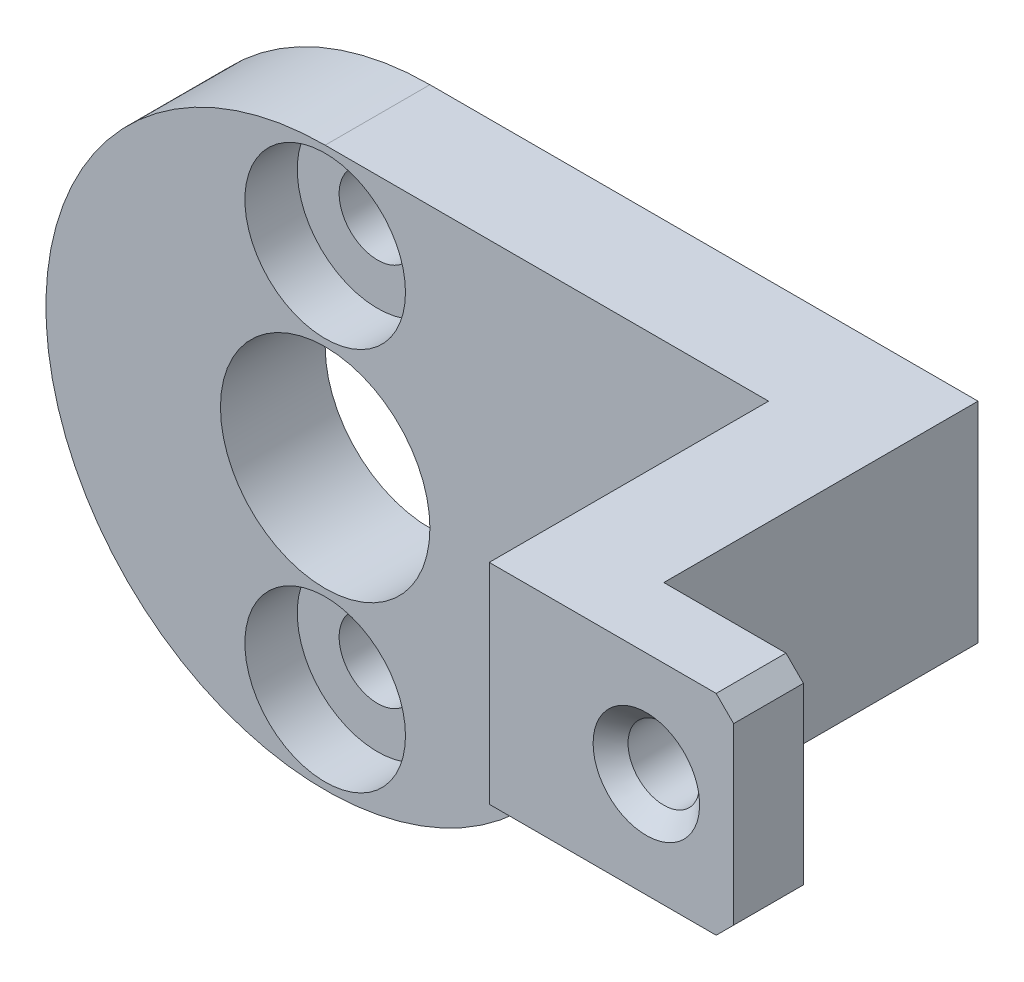
ISO-10303-21;
HEADER;
FILE_DESCRIPTION(('STEP AP214'),'2;1');
FILE_NAME('part.step','',(''),(''),'','','');
FILE_SCHEMA(('AUTOMOTIVE_DESIGN { 1 0 10303 214 1 1 1 1 }'));
ENDSEC;
DATA;
#1=APPLICATION_CONTEXT('core data for automotive mechanical design processes');
#2=APPLICATION_PROTOCOL_DEFINITION('international standard','automotive_design',2000,#1);
#3=PRODUCT_CONTEXT('',#1,'mechanical');
#4=PRODUCT('Part','Part','',(#3));
#5=PRODUCT_RELATED_PRODUCT_CATEGORY('part','',(#4));
#6=PRODUCT_DEFINITION_FORMATION('','',#4);
#7=PRODUCT_DEFINITION_CONTEXT('part definition',#1,'design');
#8=PRODUCT_DEFINITION('design','',#6,#7);
#9=PRODUCT_DEFINITION_SHAPE('','',#8);
#10=(LENGTH_UNIT() NAMED_UNIT(*) SI_UNIT(.MILLI.,.METRE.));
#11=(NAMED_UNIT(*) PLANE_ANGLE_UNIT() SI_UNIT($,.RADIAN.));
#12=(NAMED_UNIT(*) SI_UNIT($,.STERADIAN.) SOLID_ANGLE_UNIT());
#13=UNCERTAINTY_MEASURE_WITH_UNIT(LENGTH_MEASURE(1.E-05),#10,'distance_accuracy_value','');
#14=(GEOMETRIC_REPRESENTATION_CONTEXT(3) GLOBAL_UNCERTAINTY_ASSIGNED_CONTEXT((#13)) GLOBAL_UNIT_ASSIGNED_CONTEXT((#10,
#11,#12)) REPRESENTATION_CONTEXT('',''));
#15=CARTESIAN_POINT('',(0.,0.,0.));
#16=DIRECTION('',(0.,0.,1.));
#17=DIRECTION('',(1.,0.,0.));
#18=AXIS2_PLACEMENT_3D('',#15,#16,#17);
#19=CARTESIAN_POINT('',(-7.15,8.,1.));
#20=DIRECTION('',(0.,-1.,0.));
#21=DIRECTION('',(0.,0.,-1.));
#22=AXIS2_PLACEMENT_3D('',#19,#20,#21);
#23=PLANE('',#22);
#24=DIRECTION('',(0.,0.,-1.));
#25=VECTOR('',#24,1.);
#26=CARTESIAN_POINT('',(10.15,8.,7.));
#27=LINE('',#26,#25);
#28=CARTESIAN_POINT('',(10.15,8.,9.));
#29=VERTEX_POINT('',#28);
#30=CARTESIAN_POINT('',(10.15,8.,1.));
#31=VERTEX_POINT('',#30);
#32=EDGE_CURVE('E126',#29,#31,#27,.T.);
#33=ORIENTED_EDGE('',*,*,#32,.F.);
#34=DIRECTION('',(-1.,0.,0.));
#35=VECTOR('',#34,1.);
#36=CARTESIAN_POINT('',(7.15,8.,9.));
#37=LINE('',#36,#35);
#38=CARTESIAN_POINT('',(16.65,8.,9.));
#39=VERTEX_POINT('',#38);
#40=EDGE_CURVE('E129',#39,#29,#37,.T.);
#41=ORIENTED_EDGE('',*,*,#40,.F.);
#42=DIRECTION('',(0.,0.,-1.));
#43=VECTOR('',#42,1.);
#44=CARTESIAN_POINT('',(16.65,8.,7.));
#45=LINE('',#44,#43);
#46=CARTESIAN_POINT('',(16.65,8.,7.));
#47=VERTEX_POINT('',#46);
#48=EDGE_CURVE('E242',#39,#47,#45,.T.);
#49=ORIENTED_EDGE('',*,*,#48,.T.);
#50=DIRECTION('',(-1.,0.,0.));
#51=VECTOR('',#50,1.);
#52=CARTESIAN_POINT('',(17.15,8.,7.));
#53=LINE('',#52,#51);
#54=CARTESIAN_POINT('',(13.15,8.,7.));
#55=VERTEX_POINT('',#54);
#56=EDGE_CURVE('E152',#47,#55,#53,.T.);
#57=ORIENTED_EDGE('',*,*,#56,.T.);
#58=DIRECTION('',(0.,0.,1.));
#59=VECTOR('',#58,1.);
#60=CARTESIAN_POINT('',(13.15,8.,-0.999999999999999));
#61=LINE('',#60,#59);
#62=CARTESIAN_POINT('',(13.15,8.,-2.));
#63=VERTEX_POINT('',#62);
#64=EDGE_CURVE('E204',#63,#55,#61,.T.);
#65=ORIENTED_EDGE('',*,*,#64,.F.);
#66=DIRECTION('',(1.,0.,0.));
#67=VECTOR('',#66,1.);
#68=CARTESIAN_POINT('',(-10.55,8.,-2.));
#69=LINE('',#68,#67);
#70=CARTESIAN_POINT('',(-2.55,8.,-2.));
#71=VERTEX_POINT('',#70);
#72=EDGE_CURVE('E196',#71,#63,#69,.T.);
#73=ORIENTED_EDGE('',*,*,#72,.F.);
#74=DIRECTION('',(0.,0.,-1.));
#75=VECTOR('',#74,1.);
#76=CARTESIAN_POINT('',(-2.55,8.,8.));
#77=LINE('',#76,#75);
#78=CARTESIAN_POINT('',(-2.55,8.,1.));
#79=VERTEX_POINT('',#78);
#80=EDGE_CURVE('E343',#79,#71,#77,.T.);
#81=ORIENTED_EDGE('',*,*,#80,.F.);
#82=DIRECTION('',(-1.,0.,0.));
#83=VECTOR('',#82,1.);
#84=CARTESIAN_POINT('',(-7.15,8.,1.));
#85=LINE('',#84,#83);
#86=EDGE_CURVE('E133',#31,#79,#85,.T.);
#87=ORIENTED_EDGE('',*,*,#86,.F.);
#88=EDGE_LOOP('',(#33,#41,#49,#57,#65,#73,#81,#87));
#89=FACE_BOUND('',#88,.T.);
#90=ADVANCED_FACE('F38',(#89),#23,.F.);
#91=CARTESIAN_POINT('',(-7.15,-8.,1.));
#92=DIRECTION('',(0.,0.,1.));
#93=DIRECTION('',(1.,0.,0.));
#94=AXIS2_PLACEMENT_3D('',#91,#92,#93);
#95=PLANE('',#94);
#96=CARTESIAN_POINT('',(-2.55,5.5,1.));
#97=DIRECTION('',(0.,0.,1.));
#98=DIRECTION('',(1.,0.,0.));
#99=AXIS2_PLACEMENT_3D('',#96,#97,#98);
#100=CIRCLE('',#99,2.29999999999999);
#101=CARTESIAN_POINT('',(-0.250000000000006,5.5,1.));
#102=VERTEX_POINT('',#101);
#103=EDGE_CURVE('E146',#102,#102,#100,.T.);
#104=ORIENTED_EDGE('',*,*,#103,.F.);
#105=EDGE_LOOP('',(#104));
#106=FACE_BOUND('',#105,.T.);
#107=CARTESIAN_POINT('',(-2.55,-5.5,1.));
#108=DIRECTION('',(0.,0.,1.));
#109=DIRECTION('',(1.,0.,0.));
#110=AXIS2_PLACEMENT_3D('',#107,#108,#109);
#111=CIRCLE('',#110,2.29999999999999);
#112=CARTESIAN_POINT('',(-0.250000000000005,-5.5,1.));
#113=VERTEX_POINT('',#112);
#114=EDGE_CURVE('E351',#113,#113,#111,.T.);
#115=ORIENTED_EDGE('',*,*,#114,.F.);
#116=EDGE_LOOP('',(#115));
#117=FACE_BOUND('',#116,.T.);
#118=CARTESIAN_POINT('',(-2.55,0.,1.));
#119=DIRECTION('',(0.,0.,1.));
#120=DIRECTION('',(1.,0.,0.));
#121=AXIS2_PLACEMENT_3D('',#118,#119,#120);
#122=CIRCLE('',#121,3.);
#123=CARTESIAN_POINT('',(0.450000000000003,0.,1.));
#124=VERTEX_POINT('',#123);
#125=EDGE_CURVE('E151',#124,#124,#122,.T.);
#126=ORIENTED_EDGE('',*,*,#125,.F.);
#127=EDGE_LOOP('',(#126));
#128=FACE_BOUND('',#127,.T.);
#129=ORIENTED_EDGE('',*,*,#86,.T.);
#130=CARTESIAN_POINT('',(-2.55,0.,1.));
#131=DIRECTION('',(0.,0.,1.));
#132=DIRECTION('',(1.,0.,0.));
#133=AXIS2_PLACEMENT_3D('',#130,#131,#132);
#134=CIRCLE('',#133,8.);
#135=CARTESIAN_POINT('',(5.45,0.,1.));
#136=VERTEX_POINT('',#135);
#137=EDGE_CURVE('E330',#79,#136,#134,.T.);
#138=ORIENTED_EDGE('',*,*,#137,.T.);
#139=DIRECTION('',(0.,1.,0.));
#140=VECTOR('',#139,1.);
#141=CARTESIAN_POINT('',(5.45,-8.,1.));
#142=LINE('',#141,#140);
#143=CARTESIAN_POINT('',(5.45,1.,1.));
#144=VERTEX_POINT('',#143);
#145=EDGE_CURVE('E137',#136,#144,#142,.T.);
#146=ORIENTED_EDGE('',*,*,#145,.T.);
#147=CARTESIAN_POINT('',(6.45,1.,0.999999999999999));
#148=DIRECTION('',(0.,0.,1.));
#149=DIRECTION('',(1.,0.,0.));
#150=AXIS2_PLACEMENT_3D('',#147,#148,#149);
#151=CIRCLE('',#150,1.);
#152=CARTESIAN_POINT('',(6.45,2.,1.));
#153=VERTEX_POINT('',#152);
#154=EDGE_CURVE('E11',#144,#153,#151,.F.);
#155=ORIENTED_EDGE('',*,*,#154,.T.);
#156=DIRECTION('',(-1.,0.,0.));
#157=VECTOR('',#156,1.);
#158=CARTESIAN_POINT('',(-7.15,2.,1.));
#159=LINE('',#158,#157);
#160=CARTESIAN_POINT('',(10.15,2.,1.));
#161=VERTEX_POINT('',#160);
#162=EDGE_CURVE('E185',#161,#153,#159,.T.);
#163=ORIENTED_EDGE('',*,*,#162,.F.);
#164=DIRECTION('',(0.,-1.,0.));
#165=VECTOR('',#164,1.);
#166=CARTESIAN_POINT('',(10.15,8.,1.));
#167=LINE('',#166,#165);
#168=EDGE_CURVE('E206',#31,#161,#167,.T.);
#169=ORIENTED_EDGE('',*,*,#168,.F.);
#170=EDGE_LOOP('',(#129,#138,#146,#155,#163,#169));
#171=FACE_BOUND('',#170,.T.);
#172=ADVANCED_FACE('F272',(#106,#117,#128,#171),#95,.T.);
#173=CARTESIAN_POINT('',(5.45,-8.,-23.6274169979695));
#174=DIRECTION('',(1.,0.,0.));
#175=DIRECTION('',(0.,0.,-1.));
#176=AXIS2_PLACEMENT_3D('',#173,#174,#175);
#177=PLANE('',#176);
#178=DIRECTION('',(0.,-1.,0.));
#179=VECTOR('',#178,1.);
#180=CARTESIAN_POINT('',(5.45,2.,-2.));
#181=LINE('',#180,#179);
#182=CARTESIAN_POINT('',(5.45,1.,-2.));
#183=VERTEX_POINT('',#182);
#184=CARTESIAN_POINT('',(5.45,0.,-2.));
#185=VERTEX_POINT('',#184);
#186=EDGE_CURVE('E192',#183,#185,#181,.T.);
#187=ORIENTED_EDGE('',*,*,#186,.F.);
#188=DIRECTION('',(0.,0.,-1.));
#189=VECTOR('',#188,1.);
#190=CARTESIAN_POINT('',(5.45,1.,-23.6274169979695));
#191=LINE('',#190,#189);
#192=EDGE_CURVE('E59',#183,#144,#191,.F.);
#193=ORIENTED_EDGE('',*,*,#192,.T.);
#194=ORIENTED_EDGE('',*,*,#145,.F.);
#195=DIRECTION('',(0.,0.,-1.));
#196=VECTOR('',#195,1.);
#197=CARTESIAN_POINT('',(5.45,0.,8.));
#198=LINE('',#197,#196);
#199=EDGE_CURVE('E335',#136,#185,#198,.T.);
#200=ORIENTED_EDGE('',*,*,#199,.T.);
#201=EDGE_LOOP('',(#187,#193,#194,#200));
#202=FACE_BOUND('',#201,.T.);
#203=ADVANCED_FACE('F277',(#202),#177,.T.);
#204=CARTESIAN_POINT('',(13.15,8.,-2.));
#205=DIRECTION('',(0.,0.,-1.));
#206=DIRECTION('',(-1.,0.,0.));
#207=AXIS2_PLACEMENT_3D('',#204,#205,#206);
#208=PLANE('',#207);
#209=CARTESIAN_POINT('',(-2.55,0.,-2.));
#210=DIRECTION('',(0.,0.,-1.));
#211=DIRECTION('',(-1.,0.,0.));
#212=AXIS2_PLACEMENT_3D('',#209,#210,#211);
#213=CIRCLE('',#212,3.);
#214=CARTESIAN_POINT('',(-5.55,0.,-2.));
#215=VERTEX_POINT('',#214);
#216=EDGE_CURVE('E328',#215,#215,#213,.T.);
#217=ORIENTED_EDGE('',*,*,#216,.F.);
#218=EDGE_LOOP('',(#217));
#219=FACE_BOUND('',#218,.T.);
#220=CARTESIAN_POINT('',(-2.55,5.5,-2.));
#221=DIRECTION('',(0.,0.,-1.));
#222=DIRECTION('',(-1.,0.,0.));
#223=AXIS2_PLACEMENT_3D('',#220,#221,#222);
#224=CIRCLE('',#223,1.1);
#225=CARTESIAN_POINT('',(-3.65,5.5,-2.));
#226=VERTEX_POINT('',#225);
#227=EDGE_CURVE('E333',#226,#226,#224,.T.);
#228=ORIENTED_EDGE('',*,*,#227,.F.);
#229=EDGE_LOOP('',(#228));
#230=FACE_BOUND('',#229,.T.);
#231=CARTESIAN_POINT('',(-2.55,-5.5,-2.));
#232=DIRECTION('',(0.,0.,-1.));
#233=DIRECTION('',(-1.,0.,0.));
#234=AXIS2_PLACEMENT_3D('',#231,#232,#233);
#235=CIRCLE('',#234,1.1);
#236=CARTESIAN_POINT('',(-3.65,-5.5,-2.));
#237=VERTEX_POINT('',#236);
#238=EDGE_CURVE('E329',#237,#237,#235,.T.);
#239=ORIENTED_EDGE('',*,*,#238,.F.);
#240=EDGE_LOOP('',(#239));
#241=FACE_BOUND('',#240,.T.);
#242=DIRECTION('',(-1.,0.,0.));
#243=VECTOR('',#242,1.);
#244=CARTESIAN_POINT('',(13.15,2.,-2.));
#245=LINE('',#244,#243);
#246=CARTESIAN_POINT('',(13.15,2.,-2.));
#247=VERTEX_POINT('',#246);
#248=CARTESIAN_POINT('',(6.45,2.,-2.));
#249=VERTEX_POINT('',#248);
#250=EDGE_CURVE('E183',#247,#249,#245,.T.);
#251=ORIENTED_EDGE('',*,*,#250,.T.);
#252=CARTESIAN_POINT('',(6.45,1.,-2.));
#253=DIRECTION('',(0.,0.,-1.));
#254=DIRECTION('',(-1.,0.,0.));
#255=AXIS2_PLACEMENT_3D('',#252,#253,#254);
#256=CIRCLE('',#255,1.);
#257=EDGE_CURVE('E46',#249,#183,#256,.F.);
#258=ORIENTED_EDGE('',*,*,#257,.T.);
#259=ORIENTED_EDGE('',*,*,#186,.T.);
#260=CARTESIAN_POINT('',(-2.55,0.,-2.));
#261=DIRECTION('',(0.,0.,-1.));
#262=DIRECTION('',(-1.,0.,0.));
#263=AXIS2_PLACEMENT_3D('',#260,#261,#262);
#264=CIRCLE('',#263,8.);
#265=EDGE_CURVE('E172',#185,#71,#264,.T.);
#266=ORIENTED_EDGE('',*,*,#265,.T.);
#267=ORIENTED_EDGE('',*,*,#72,.T.);
#268=DIRECTION('',(0.,-1.,0.));
#269=VECTOR('',#268,1.);
#270=CARTESIAN_POINT('',(13.15,8.,-2.));
#271=LINE('',#270,#269);
#272=EDGE_CURVE('E191',#63,#247,#271,.T.);
#273=ORIENTED_EDGE('',*,*,#272,.T.);
#274=EDGE_LOOP('',(#251,#258,#259,#266,#267,#273));
#275=FACE_BOUND('',#274,.T.);
#276=ADVANCED_FACE('F189',(#219,#230,#241,#275),#208,.T.);
#277=CARTESIAN_POINT('',(-2.55,0.,9.));
#278=DIRECTION('',(0.,0.,-1.));
#279=DIRECTION('',(-1.,0.,0.));
#280=AXIS2_PLACEMENT_3D('',#277,#278,#279);
#281=CYLINDRICAL_SURFACE('',#280,3.);
#282=ORIENTED_EDGE('',*,*,#125,.T.);
#283=EDGE_LOOP('',(#282));
#284=FACE_BOUND('',#283,.T.);
#285=ORIENTED_EDGE('',*,*,#216,.T.);
#286=EDGE_LOOP('',(#285));
#287=FACE_BOUND('',#286,.T.);
#288=ADVANCED_FACE('F316',(#284,#287),#281,.F.);
#289=CARTESIAN_POINT('',(7.15,-8.,9.));
#290=DIRECTION('',(0.,0.,-1.));
#291=DIRECTION('',(-1.,0.,0.));
#292=AXIS2_PLACEMENT_3D('',#289,#290,#291);
#293=PLANE('',#292);
#294=CARTESIAN_POINT('',(14.65,5.,9.));
#295=DIRECTION('',(0.,0.,-1.));
#296=DIRECTION('',(-1.,0.,0.));
#297=AXIS2_PLACEMENT_3D('',#294,#295,#296);
#298=CIRCLE('',#297,1.52499999999999);
#299=CARTESIAN_POINT('',(13.125,5.,9.));
#300=VERTEX_POINT('',#299);
#301=EDGE_CURVE('E238',#300,#300,#298,.T.);
#302=ORIENTED_EDGE('',*,*,#301,.T.);
#303=EDGE_LOOP('',(#302));
#304=FACE_BOUND('',#303,.T.);
#305=ORIENTED_EDGE('',*,*,#40,.T.);
#306=DIRECTION('',(0.,-1.,0.));
#307=VECTOR('',#306,1.);
#308=CARTESIAN_POINT('',(10.15,-8.,9.));
#309=LINE('',#308,#307);
#310=CARTESIAN_POINT('',(10.15,2.,9.));
#311=VERTEX_POINT('',#310);
#312=EDGE_CURVE('E141',#29,#311,#309,.T.);
#313=ORIENTED_EDGE('',*,*,#312,.T.);
#314=DIRECTION('',(-1.,0.,0.));
#315=VECTOR('',#314,1.);
#316=CARTESIAN_POINT('',(2.85,2.,9.));
#317=LINE('',#316,#315);
#318=CARTESIAN_POINT('',(16.65,2.,9.));
#319=VERTEX_POINT('',#318);
#320=EDGE_CURVE('E213',#319,#311,#317,.T.);
#321=ORIENTED_EDGE('',*,*,#320,.F.);
#322=DIRECTION('',(0.707106781186545,0.70710678118655,0.));
#323=VECTOR('',#322,1.);
#324=CARTESIAN_POINT('',(16.65,2.,9.));
#325=LINE('',#324,#323);
#326=CARTESIAN_POINT('',(17.15,2.5,9.));
#327=VERTEX_POINT('',#326);
#328=EDGE_CURVE('E235',#319,#327,#325,.T.);
#329=ORIENTED_EDGE('',*,*,#328,.T.);
#330=DIRECTION('',(0.,-1.,0.));
#331=VECTOR('',#330,1.);
#332=CARTESIAN_POINT('',(17.15,8.,9.));
#333=LINE('',#332,#331);
#334=CARTESIAN_POINT('',(17.15,7.5,9.));
#335=VERTEX_POINT('',#334);
#336=EDGE_CURVE('E218',#335,#327,#333,.T.);
#337=ORIENTED_EDGE('',*,*,#336,.F.);
#338=DIRECTION('',(-0.707106781186548,0.707106781186548,0.));
#339=VECTOR('',#338,1.);
#340=CARTESIAN_POINT('',(17.15,7.5,9.));
#341=LINE('',#340,#339);
#342=EDGE_CURVE('E150',#335,#39,#341,.T.);
#343=ORIENTED_EDGE('',*,*,#342,.T.);
#344=EDGE_LOOP('',(#305,#313,#321,#329,#337,#343));
#345=FACE_BOUND('',#344,.T.);
#346=ADVANCED_FACE('F148',(#304,#345),#293,.F.);
#347=CARTESIAN_POINT('',(17.15,8.,7.));
#348=DIRECTION('',(0.,0.,1.));
#349=DIRECTION('',(0.,-1.,0.));
#350=AXIS2_PLACEMENT_3D('',#347,#348,#349);
#351=PLANE('',#350);
#352=CARTESIAN_POINT('',(14.65,5.,7.));
#353=DIRECTION('',(0.,0.,1.));
#354=DIRECTION('',(0.,-1.,0.));
#355=AXIS2_PLACEMENT_3D('',#352,#353,#354);
#356=CIRCLE('',#355,1.02499999999999);
#357=CARTESIAN_POINT('',(14.65,3.97500000000001,7.));
#358=VERTEX_POINT('',#357);
#359=EDGE_CURVE('E210',#358,#358,#356,.T.);
#360=ORIENTED_EDGE('',*,*,#359,.T.);
#361=EDGE_LOOP('',(#360));
#362=FACE_BOUND('',#361,.T.);
#363=DIRECTION('',(-1.,0.,0.));
#364=VECTOR('',#363,1.);
#365=CARTESIAN_POINT('',(17.15,2.,7.));
#366=LINE('',#365,#364);
#367=CARTESIAN_POINT('',(16.65,2.,7.));
#368=VERTEX_POINT('',#367);
#369=CARTESIAN_POINT('',(13.15,2.,7.));
#370=VERTEX_POINT('',#369);
#371=EDGE_CURVE('E215',#368,#370,#366,.T.);
#372=ORIENTED_EDGE('',*,*,#371,.T.);
#373=DIRECTION('',(0.,-1.,0.));
#374=VECTOR('',#373,1.);
#375=CARTESIAN_POINT('',(13.15,8.,7.));
#376=LINE('',#375,#374);
#377=EDGE_CURVE('E194',#55,#370,#376,.T.);
#378=ORIENTED_EDGE('',*,*,#377,.F.);
#379=ORIENTED_EDGE('',*,*,#56,.F.);
#380=DIRECTION('',(0.707106781186548,-0.707106781186548,0.));
#381=VECTOR('',#380,1.);
#382=CARTESIAN_POINT('',(17.15,7.5,7.));
#383=LINE('',#382,#381);
#384=CARTESIAN_POINT('',(17.15,7.5,7.));
#385=VERTEX_POINT('',#384);
#386=EDGE_CURVE('E234',#47,#385,#383,.T.);
#387=ORIENTED_EDGE('',*,*,#386,.T.);
#388=DIRECTION('',(0.,1.,0.));
#389=VECTOR('',#388,1.);
#390=CARTESIAN_POINT('',(17.15,8.,7.));
#391=LINE('',#390,#389);
#392=CARTESIAN_POINT('',(17.15,2.5,7.));
#393=VERTEX_POINT('',#392);
#394=EDGE_CURVE('E157',#393,#385,#391,.T.);
#395=ORIENTED_EDGE('',*,*,#394,.F.);
#396=DIRECTION('',(-0.707106781186545,-0.70710678118655,0.));
#397=VECTOR('',#396,1.);
#398=CARTESIAN_POINT('',(16.65,2.,7.));
#399=LINE('',#398,#397);
#400=EDGE_CURVE('E245',#393,#368,#399,.T.);
#401=ORIENTED_EDGE('',*,*,#400,.T.);
#402=EDGE_LOOP('',(#372,#378,#379,#387,#395,#401));
#403=FACE_BOUND('',#402,.T.);
#404=ADVANCED_FACE('F252',(#362,#403),#351,.F.);
#405=CARTESIAN_POINT('',(17.15,-8.,9.));
#406=DIRECTION('',(1.,0.,0.));
#407=DIRECTION('',(0.,0.,-1.));
#408=AXIS2_PLACEMENT_3D('',#405,#406,#407);
#409=PLANE('',#408);
#410=ORIENTED_EDGE('',*,*,#394,.T.);
#411=DIRECTION('',(0.,0.,1.));
#412=VECTOR('',#411,1.);
#413=CARTESIAN_POINT('',(17.15,7.5,9.));
#414=LINE('',#413,#412);
#415=EDGE_CURVE('E227',#385,#335,#414,.T.);
#416=ORIENTED_EDGE('',*,*,#415,.T.);
#417=ORIENTED_EDGE('',*,*,#336,.T.);
#418=DIRECTION('',(0.,0.,-1.));
#419=VECTOR('',#418,1.);
#420=CARTESIAN_POINT('',(17.15,2.5,7.));
#421=LINE('',#420,#419);
#422=EDGE_CURVE('E228',#327,#393,#421,.T.);
#423=ORIENTED_EDGE('',*,*,#422,.T.);
#424=EDGE_LOOP('',(#410,#416,#417,#423));
#425=FACE_BOUND('',#424,.T.);
#426=ADVANCED_FACE('F226',(#425),#409,.T.);
#427=CARTESIAN_POINT('',(2.85,2.,9.));
#428=DIRECTION('',(0.,1.,0.));
#429=DIRECTION('',(0.,0.,1.));
#430=AXIS2_PLACEMENT_3D('',#427,#428,#429);
#431=PLANE('',#430);
#432=ORIENTED_EDGE('',*,*,#320,.T.);
#433=DIRECTION('',(0.,0.,1.));
#434=VECTOR('',#433,1.);
#435=CARTESIAN_POINT('',(10.15,2.,1.));
#436=LINE('',#435,#434);
#437=EDGE_CURVE('E138',#161,#311,#436,.T.);
#438=ORIENTED_EDGE('',*,*,#437,.F.);
#439=ORIENTED_EDGE('',*,*,#162,.T.);
#440=DIRECTION('',(0.,0.,-1.));
#441=VECTOR('',#440,1.);
#442=CARTESIAN_POINT('',(6.45,2.,9.));
#443=LINE('',#442,#441);
#444=EDGE_CURVE('E175',#153,#249,#443,.T.);
#445=ORIENTED_EDGE('',*,*,#444,.T.);
#446=ORIENTED_EDGE('',*,*,#250,.F.);
#447=DIRECTION('',(0.,0.,-1.));
#448=VECTOR('',#447,1.);
#449=CARTESIAN_POINT('',(13.15,2.,7.));
#450=LINE('',#449,#448);
#451=EDGE_CURVE('E202',#370,#247,#450,.T.);
#452=ORIENTED_EDGE('',*,*,#451,.F.);
#453=ORIENTED_EDGE('',*,*,#371,.F.);
#454=DIRECTION('',(0.,0.,1.));
#455=VECTOR('',#454,1.);
#456=CARTESIAN_POINT('',(16.65,2.,9.));
#457=LINE('',#456,#455);
#458=EDGE_CURVE('E170',#368,#319,#457,.T.);
#459=ORIENTED_EDGE('',*,*,#458,.T.);
#460=EDGE_LOOP('',(#432,#438,#439,#445,#446,#452,#453,#459));
#461=FACE_BOUND('',#460,.T.);
#462=ADVANCED_FACE('F182',(#461),#431,.F.);
#463=CARTESIAN_POINT('',(14.65,5.,9.));
#464=DIRECTION('',(0.,0.,1.));
#465=DIRECTION('',(1.,0.,0.));
#466=AXIS2_PLACEMENT_3D('',#463,#464,#465);
#467=CYLINDRICAL_SURFACE('',#466,1.02499999999999);
#468=CARTESIAN_POINT('',(14.65,5.,8.5));
#469=DIRECTION('',(0.,0.,-1.));
#470=DIRECTION('',(-1.,0.,0.));
#471=AXIS2_PLACEMENT_3D('',#468,#469,#470);
#472=CIRCLE('',#471,1.02499999999999);
#473=CARTESIAN_POINT('',(13.625,5.,8.5));
#474=VERTEX_POINT('',#473);
#475=EDGE_CURVE('E169',#474,#474,#472,.F.);
#476=ORIENTED_EDGE('',*,*,#475,.T.);
#477=EDGE_LOOP('',(#476));
#478=FACE_BOUND('',#477,.T.);
#479=ORIENTED_EDGE('',*,*,#359,.F.);
#480=EDGE_LOOP('',(#479));
#481=FACE_BOUND('',#480,.T.);
#482=ADVANCED_FACE('F285',(#478,#481),#467,.F.);
#483=CARTESIAN_POINT('',(14.65,5.,8.5));
#484=DIRECTION('',(0.,0.,1.));
#485=DIRECTION('',(1.,0.,0.));
#486=AXIS2_PLACEMENT_3D('',#483,#484,#485);
#487=CONICAL_SURFACE('',#486,1.02499999999999,0.785398163397448);
#488=ORIENTED_EDGE('',*,*,#301,.F.);
#489=EDGE_LOOP('',(#488));
#490=FACE_BOUND('',#489,.T.);
#491=ORIENTED_EDGE('',*,*,#475,.F.);
#492=EDGE_LOOP('',(#491));
#493=FACE_BOUND('',#492,.T.);
#494=ADVANCED_FACE('F282',(#490,#493),#487,.F.);
#495=CARTESIAN_POINT('',(17.15,7.5,9.));
#496=DIRECTION('',(0.707106781186547,0.707106781186547,0.));
#497=DIRECTION('',(-0.707106781186548,0.707106781186548,0.));
#498=AXIS2_PLACEMENT_3D('',#495,#496,#497);
#499=PLANE('',#498);
#500=ORIENTED_EDGE('',*,*,#386,.F.);
#501=ORIENTED_EDGE('',*,*,#48,.F.);
#502=ORIENTED_EDGE('',*,*,#342,.F.);
#503=ORIENTED_EDGE('',*,*,#415,.F.);
#504=EDGE_LOOP('',(#500,#501,#502,#503));
#505=FACE_BOUND('',#504,.T.);
#506=ADVANCED_FACE('F233',(#505),#499,.T.);
#507=CARTESIAN_POINT('',(16.65,2.,9.));
#508=DIRECTION('',(0.70710678118655,-0.707106781186545,0.));
#509=DIRECTION('',(0.707106781186545,0.70710678118655,0.));
#510=AXIS2_PLACEMENT_3D('',#507,#508,#509);
#511=PLANE('',#510);
#512=ORIENTED_EDGE('',*,*,#400,.F.);
#513=ORIENTED_EDGE('',*,*,#422,.F.);
#514=ORIENTED_EDGE('',*,*,#328,.F.);
#515=ORIENTED_EDGE('',*,*,#458,.F.);
#516=EDGE_LOOP('',(#512,#513,#514,#515));
#517=FACE_BOUND('',#516,.T.);
#518=ADVANCED_FACE('F251',(#517),#511,.T.);
#519=CARTESIAN_POINT('',(-2.55,-5.5,-1.));
#520=DIRECTION('',(0.,0.,1.));
#521=DIRECTION('',(1.,0.,0.));
#522=AXIS2_PLACEMENT_3D('',#519,#520,#521);
#523=CYLINDRICAL_SURFACE('',#522,1.1);
#524=CARTESIAN_POINT('',(-2.55,-5.5,-0.500000000000001));
#525=DIRECTION('',(0.,0.,1.));
#526=DIRECTION('',(1.,0.,0.));
#527=AXIS2_PLACEMENT_3D('',#524,#525,#526);
#528=CIRCLE('',#527,1.1);
#529=CARTESIAN_POINT('',(-1.44999999999999,-5.5,-0.500000000000001));
#530=VERTEX_POINT('',#529);
#531=EDGE_CURVE('E345',#530,#530,#528,.T.);
#532=ORIENTED_EDGE('',*,*,#531,.T.);
#533=EDGE_LOOP('',(#532));
#534=FACE_BOUND('',#533,.T.);
#535=ORIENTED_EDGE('',*,*,#238,.T.);
#536=EDGE_LOOP('',(#535));
#537=FACE_BOUND('',#536,.T.);
#538=ADVANCED_FACE('F289',(#534,#537),#523,.F.);
#539=CARTESIAN_POINT('',(-2.55,5.5,-1.));
#540=DIRECTION('',(0.,0.,1.));
#541=DIRECTION('',(1.,0.,0.));
#542=AXIS2_PLACEMENT_3D('',#539,#540,#541);
#543=CYLINDRICAL_SURFACE('',#542,1.1);
#544=CARTESIAN_POINT('',(-2.55,5.5,-0.500000000000001));
#545=DIRECTION('',(0.,0.,1.));
#546=DIRECTION('',(1.,0.,0.));
#547=AXIS2_PLACEMENT_3D('',#544,#545,#546);
#548=CIRCLE('',#547,1.1);
#549=CARTESIAN_POINT('',(-1.44999999999999,5.5,-0.500000000000001));
#550=VERTEX_POINT('',#549);
#551=EDGE_CURVE('E354',#550,#550,#548,.T.);
#552=ORIENTED_EDGE('',*,*,#551,.T.);
#553=EDGE_LOOP('',(#552));
#554=FACE_BOUND('',#553,.T.);
#555=ORIENTED_EDGE('',*,*,#227,.T.);
#556=EDGE_LOOP('',(#555));
#557=FACE_BOUND('',#556,.T.);
#558=ADVANCED_FACE('F268',(#554,#557),#543,.F.);
#559=CARTESIAN_POINT('',(10.15,2.,1.));
#560=DIRECTION('',(-1.,0.,0.));
#561=DIRECTION('',(0.,0.,1.));
#562=AXIS2_PLACEMENT_3D('',#559,#560,#561);
#563=PLANE('',#562);
#564=ORIENTED_EDGE('',*,*,#437,.T.);
#565=ORIENTED_EDGE('',*,*,#312,.F.);
#566=ORIENTED_EDGE('',*,*,#32,.T.);
#567=ORIENTED_EDGE('',*,*,#168,.T.);
#568=EDGE_LOOP('',(#564,#565,#566,#567));
#569=FACE_BOUND('',#568,.T.);
#570=ADVANCED_FACE('F142',(#569),#563,.T.);
#571=CARTESIAN_POINT('',(13.15,2.,7.));
#572=DIRECTION('',(1.,0.,0.));
#573=DIRECTION('',(0.,0.,-1.));
#574=AXIS2_PLACEMENT_3D('',#571,#572,#573);
#575=PLANE('',#574);
#576=ORIENTED_EDGE('',*,*,#377,.T.);
#577=ORIENTED_EDGE('',*,*,#451,.T.);
#578=ORIENTED_EDGE('',*,*,#272,.F.);
#579=ORIENTED_EDGE('',*,*,#64,.T.);
#580=EDGE_LOOP('',(#576,#577,#578,#579));
#581=FACE_BOUND('',#580,.T.);
#582=ADVANCED_FACE('F257',(#581),#575,.T.);
#583=CARTESIAN_POINT('',(-2.55,0.,8.));
#584=DIRECTION('',(0.,0.,-1.));
#585=DIRECTION('',(-1.,0.,0.));
#586=AXIS2_PLACEMENT_3D('',#583,#584,#585);
#587=CYLINDRICAL_SURFACE('',#586,8.);
#588=ORIENTED_EDGE('',*,*,#80,.T.);
#589=ORIENTED_EDGE('',*,*,#265,.F.);
#590=ORIENTED_EDGE('',*,*,#199,.F.);
#591=ORIENTED_EDGE('',*,*,#137,.F.);
#592=EDGE_LOOP('',(#588,#589,#590,#591));
#593=FACE_BOUND('',#592,.T.);
#594=ADVANCED_FACE('F259',(#593),#587,.T.);
#595=CARTESIAN_POINT('',(-1.44999999999999,-5.5,-0.500000000000001));
#596=DIRECTION('',(0.,0.,-1.));
#597=DIRECTION('',(-1.,0.,0.));
#598=AXIS2_PLACEMENT_3D('',#595,#596,#597);
#599=PLANE('',#598);
#600=ORIENTED_EDGE('',*,*,#531,.F.);
#601=EDGE_LOOP('',(#600));
#602=FACE_BOUND('',#601,.T.);
#603=CARTESIAN_POINT('',(-2.55,-5.5,-0.500000000000001));
#604=DIRECTION('',(0.,0.,1.));
#605=DIRECTION('',(1.,0.,0.));
#606=AXIS2_PLACEMENT_3D('',#603,#604,#605);
#607=CIRCLE('',#606,2.3);
#608=CARTESIAN_POINT('',(-0.250000000000002,-5.5,-0.500000000000001));
#609=VERTEX_POINT('',#608);
#610=EDGE_CURVE('E348',#609,#609,#607,.T.);
#611=ORIENTED_EDGE('',*,*,#610,.T.);
#612=EDGE_LOOP('',(#611));
#613=FACE_BOUND('',#612,.T.);
#614=ADVANCED_FACE('F265',(#602,#613),#599,.F.);
#615=CARTESIAN_POINT('',(-2.55,-5.5,1.));
#616=DIRECTION('',(0.,0.,1.));
#617=DIRECTION('',(1.,0.,0.));
#618=AXIS2_PLACEMENT_3D('',#615,#616,#617);
#619=CYLINDRICAL_SURFACE('',#618,2.29999999999999);
#620=ORIENTED_EDGE('',*,*,#610,.F.);
#621=EDGE_LOOP('',(#620));
#622=FACE_BOUND('',#621,.T.);
#623=ORIENTED_EDGE('',*,*,#114,.T.);
#624=EDGE_LOOP('',(#623));
#625=FACE_BOUND('',#624,.T.);
#626=ADVANCED_FACE('F378',(#622,#625),#619,.F.);
#627=CARTESIAN_POINT('',(-1.44999999999999,5.5,-0.500000000000001));
#628=DIRECTION('',(0.,0.,-1.));
#629=DIRECTION('',(-1.,0.,0.));
#630=AXIS2_PLACEMENT_3D('',#627,#628,#629);
#631=PLANE('',#630);
#632=ORIENTED_EDGE('',*,*,#551,.F.);
#633=EDGE_LOOP('',(#632));
#634=FACE_BOUND('',#633,.T.);
#635=CARTESIAN_POINT('',(-2.55,5.5,-0.500000000000001));
#636=DIRECTION('',(0.,0.,1.));
#637=DIRECTION('',(1.,0.,0.));
#638=AXIS2_PLACEMENT_3D('',#635,#636,#637);
#639=CIRCLE('',#638,2.3);
#640=CARTESIAN_POINT('',(-0.250000000000004,5.5,-0.500000000000001));
#641=VERTEX_POINT('',#640);
#642=EDGE_CURVE('E357',#641,#641,#639,.T.);
#643=ORIENTED_EDGE('',*,*,#642,.T.);
#644=EDGE_LOOP('',(#643));
#645=FACE_BOUND('',#644,.T.);
#646=ADVANCED_FACE('F372',(#634,#645),#631,.F.);
#647=CARTESIAN_POINT('',(-2.55,5.5,1.));
#648=DIRECTION('',(0.,0.,1.));
#649=DIRECTION('',(1.,0.,0.));
#650=AXIS2_PLACEMENT_3D('',#647,#648,#649);
#651=CYLINDRICAL_SURFACE('',#650,2.29999999999999);
#652=ORIENTED_EDGE('',*,*,#642,.F.);
#653=EDGE_LOOP('',(#652));
#654=FACE_BOUND('',#653,.T.);
#655=ORIENTED_EDGE('',*,*,#103,.T.);
#656=EDGE_LOOP('',(#655));
#657=FACE_BOUND('',#656,.T.);
#658=ADVANCED_FACE('F363',(#654,#657),#651,.F.);
#659=CARTESIAN_POINT('',(6.45,1.,9.));
#660=DIRECTION('',(0.,0.,-1.));
#661=DIRECTION('',(-1.,0.,0.));
#662=AXIS2_PLACEMENT_3D('',#659,#660,#661);
#663=CYLINDRICAL_SURFACE('',#662,1.);
#664=ORIENTED_EDGE('',*,*,#154,.F.);
#665=ORIENTED_EDGE('',*,*,#192,.F.);
#666=ORIENTED_EDGE('',*,*,#257,.F.);
#667=ORIENTED_EDGE('',*,*,#444,.F.);
#668=EDGE_LOOP('',(#664,#665,#666,#667));
#669=FACE_BOUND('',#668,.T.);
#670=ADVANCED_FACE('F40',(#669),#663,.F.);
#671=CLOSED_SHELL('',(#90,#172,#203,#276,#288,#346,#404,#426,#462,#482,#494,#506,#518,#538,#558,
#570,#582,#594,#614,#626,#646,#658,#670));
#672=MANIFOLD_SOLID_BREP('B2',#671);
#673=ADVANCED_BREP_SHAPE_REPRESENTATION('',(#18,#672),#14);
#674=SHAPE_DEFINITION_REPRESENTATION(#9,#673);
ENDSEC;
END-ISO-10303-21;
